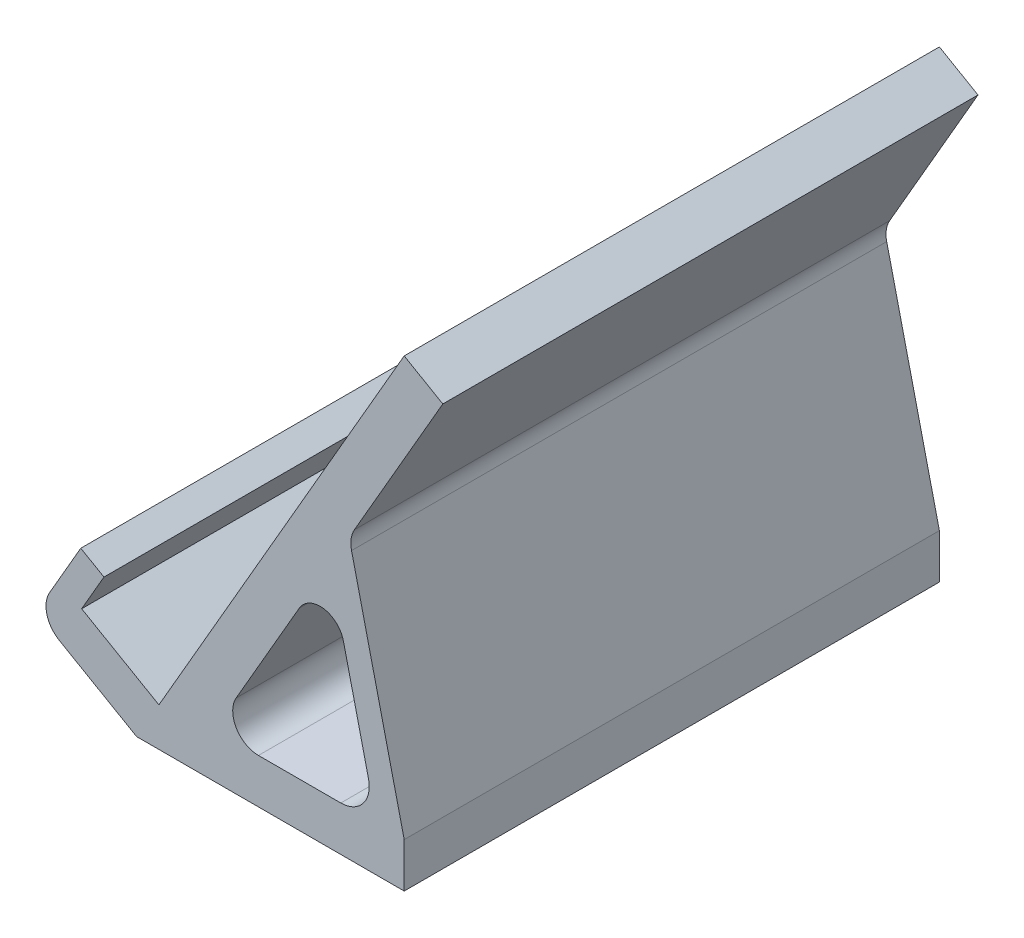
ISO-10303-21;
HEADER;
FILE_DESCRIPTION(('STEP AP214'),'2;1');
FILE_NAME('part.step','',(''),(''),'','','');
FILE_SCHEMA(('AUTOMOTIVE_DESIGN { 1 0 10303 214 1 1 1 1 }'));
ENDSEC;
DATA;
#1=APPLICATION_CONTEXT('core data for automotive mechanical design processes');
#2=APPLICATION_PROTOCOL_DEFINITION('international standard','automotive_design',2000,#1);
#3=PRODUCT_CONTEXT('',#1,'mechanical');
#4=PRODUCT('Part','Part','',(#3));
#5=PRODUCT_RELATED_PRODUCT_CATEGORY('part','',(#4));
#6=PRODUCT_DEFINITION_FORMATION('','',#4);
#7=PRODUCT_DEFINITION_CONTEXT('part definition',#1,'design');
#8=PRODUCT_DEFINITION('design','',#6,#7);
#9=PRODUCT_DEFINITION_SHAPE('','',#8);
#10=(LENGTH_UNIT() NAMED_UNIT(*) SI_UNIT(.MILLI.,.METRE.));
#11=(NAMED_UNIT(*) PLANE_ANGLE_UNIT() SI_UNIT($,.RADIAN.));
#12=(NAMED_UNIT(*) SI_UNIT($,.STERADIAN.) SOLID_ANGLE_UNIT());
#13=UNCERTAINTY_MEASURE_WITH_UNIT(LENGTH_MEASURE(1.E-05),#10,'distance_accuracy_value','');
#14=(GEOMETRIC_REPRESENTATION_CONTEXT(3) GLOBAL_UNCERTAINTY_ASSIGNED_CONTEXT((#13)) GLOBAL_UNIT_ASSIGNED_CONTEXT((#10,
#11,#12)) REPRESENTATION_CONTEXT('',''));
#15=CARTESIAN_POINT('',(0.,0.,0.));
#16=DIRECTION('',(0.,0.,1.));
#17=DIRECTION('',(1.,0.,0.));
#18=AXIS2_PLACEMENT_3D('',#15,#16,#17);
#19=CARTESIAN_POINT('',(22.891964338784,8.18932038964447,0.));
#20=DIRECTION('',(0.,0.,1.));
#21=DIRECTION('',(1.,0.,0.));
#22=AXIS2_PLACEMENT_3D('',#19,#20,#21);
#23=CYLINDRICAL_SURFACE('',#22,3.18932038964447);
#24=DIRECTION('',(0.,0.,-1.));
#25=VECTOR('',#24,1.);
#26=CARTESIAN_POINT('',(25.9966140930536,8.91933028760194,0.));
#27=LINE('',#26,#25);
#28=CARTESIAN_POINT('',(25.9966140930536,8.91933028760194,0.));
#29=VERTEX_POINT('',#28);
#30=CARTESIAN_POINT('',(25.9966140930536,8.91933028760194,60.));
#31=VERTEX_POINT('',#30);
#32=EDGE_CURVE('E329',#29,#31,#27,.F.);
#33=ORIENTED_EDGE('',*,*,#32,.F.);
#34=CARTESIAN_POINT('',(22.891964338784,8.18932038964447,0.));
#35=DIRECTION('',(0.,0.,-1.));
#36=DIRECTION('',(-1.,0.,0.));
#37=AXIS2_PLACEMENT_3D('',#34,#35,#36);
#38=CIRCLE('',#37,3.18932038964447);
#39=CARTESIAN_POINT('',(22.891964338784,5.,0.));
#40=VERTEX_POINT('',#39);
#41=EDGE_CURVE('E337',#29,#40,#38,.T.);
#42=ORIENTED_EDGE('',*,*,#41,.T.);
#43=DIRECTION('',(0.,0.,-1.));
#44=VECTOR('',#43,1.);
#45=CARTESIAN_POINT('',(22.891964338784,5.,0.));
#46=LINE('',#45,#44);
#47=CARTESIAN_POINT('',(22.891964338784,5.,60.));
#48=VERTEX_POINT('',#47);
#49=EDGE_CURVE('E333',#48,#40,#46,.T.);
#50=ORIENTED_EDGE('',*,*,#49,.F.);
#51=CARTESIAN_POINT('',(22.891964338784,8.18932038964447,60.));
#52=DIRECTION('',(0.,0.,-1.));
#53=DIRECTION('',(-1.,0.,0.));
#54=AXIS2_PLACEMENT_3D('',#51,#52,#53);
#55=CIRCLE('',#54,3.18932038964447);
#56=EDGE_CURVE('E340',#48,#31,#55,.F.);
#57=ORIENTED_EDGE('',*,*,#56,.T.);
#58=EDGE_LOOP('',(#33,#42,#50,#57));
#59=FACE_BOUND('',#58,.T.);
#60=ADVANCED_FACE('F47',(#59),#23,.F.);
#61=CARTESIAN_POINT('',(13.6602540378443,7.88675134594811,0.));
#62=DIRECTION('',(0.,0.,1.));
#63=DIRECTION('',(1.,0.,0.));
#64=AXIS2_PLACEMENT_3D('',#61,#62,#63);
#65=CYLINDRICAL_SURFACE('',#64,2.88675134594811);
#66=DIRECTION('',(0.,0.,-1.));
#67=VECTOR('',#66,1.);
#68=CARTESIAN_POINT('',(13.6602540378443,5.,0.));
#69=LINE('',#68,#67);
#70=CARTESIAN_POINT('',(13.6602540378443,5.,0.));
#71=VERTEX_POINT('',#70);
#72=CARTESIAN_POINT('',(13.6602540378443,5.,60.));
#73=VERTEX_POINT('',#72);
#74=EDGE_CURVE('E314',#71,#73,#69,.F.);
#75=ORIENTED_EDGE('',*,*,#74,.F.);
#76=CARTESIAN_POINT('',(13.6602540378443,7.88675134594811,0.));
#77=DIRECTION('',(0.,0.,-1.));
#78=DIRECTION('',(-1.,0.,0.));
#79=AXIS2_PLACEMENT_3D('',#76,#77,#78);
#80=CIRCLE('',#79,2.88675134594811);
#81=CARTESIAN_POINT('',(11.1602540378444,9.33012701892221,0.));
#82=VERTEX_POINT('',#81);
#83=EDGE_CURVE('E322',#71,#82,#80,.T.);
#84=ORIENTED_EDGE('',*,*,#83,.T.);
#85=DIRECTION('',(0.,0.,-1.));
#86=VECTOR('',#85,1.);
#87=CARTESIAN_POINT('',(11.1602540378443,9.33012701892216,0.));
#88=LINE('',#87,#86);
#89=CARTESIAN_POINT('',(11.1602540378444,9.33012701892221,60.));
#90=VERTEX_POINT('',#89);
#91=EDGE_CURVE('E318',#90,#82,#88,.T.);
#92=ORIENTED_EDGE('',*,*,#91,.F.);
#93=CARTESIAN_POINT('',(13.6602540378443,7.88675134594812,60.));
#94=DIRECTION('',(0.,0.,-1.));
#95=DIRECTION('',(-1.,0.,0.));
#96=AXIS2_PLACEMENT_3D('',#93,#94,#95);
#97=CIRCLE('',#96,2.88675134594811);
#98=EDGE_CURVE('E325',#90,#73,#97,.F.);
#99=ORIENTED_EDGE('',*,*,#98,.T.);
#100=EDGE_LOOP('',(#75,#84,#92,#99));
#101=FACE_BOUND('',#100,.T.);
#102=ADVANCED_FACE('F424',(#101),#65,.F.);
#103=CARTESIAN_POINT('',(20.5699420458708,20.2499561852727,0.));
#104=DIRECTION('',(0.,0.,1.));
#105=DIRECTION('',(1.,0.,0.));
#106=AXIS2_PLACEMENT_3D('',#103,#104,#105);
#107=CYLINDRICAL_SURFACE('',#106,2.68911427346148);
#108=DIRECTION('',(0.,0.,-1.));
#109=VECTOR('',#108,1.);
#110=CARTESIAN_POINT('',(18.2411007713738,21.5945133220034,0.));
#111=LINE('',#110,#109);
#112=CARTESIAN_POINT('',(18.2411007713738,21.5945133220034,0.));
#113=VERTEX_POINT('',#112);
#114=CARTESIAN_POINT('',(18.2411007713738,21.5945133220034,60.));
#115=VERTEX_POINT('',#114);
#116=EDGE_CURVE('E298',#113,#115,#111,.F.);
#117=ORIENTED_EDGE('',*,*,#116,.F.);
#118=CARTESIAN_POINT('',(20.5699420458708,20.2499561852727,0.));
#119=DIRECTION('',(0.,0.,-1.));
#120=DIRECTION('',(-1.,0.,0.));
#121=AXIS2_PLACEMENT_3D('',#118,#119,#120);
#122=CIRCLE('',#121,2.68911427346148);
#123=CARTESIAN_POINT('',(23.1876652433937,20.8654729087539,0.));
#124=VERTEX_POINT('',#123);
#125=EDGE_CURVE('E306',#113,#124,#122,.T.);
#126=ORIENTED_EDGE('',*,*,#125,.T.);
#127=DIRECTION('',(0.,0.,-1.));
#128=VECTOR('',#127,1.);
#129=CARTESIAN_POINT('',(23.1876652433937,20.8654729087539,0.));
#130=LINE('',#129,#128);
#131=CARTESIAN_POINT('',(23.1876652433937,20.8654729087539,60.));
#132=VERTEX_POINT('',#131);
#133=EDGE_CURVE('E302',#132,#124,#130,.T.);
#134=ORIENTED_EDGE('',*,*,#133,.F.);
#135=CARTESIAN_POINT('',(20.5699420458708,20.2499561852727,60.));
#136=DIRECTION('',(0.,0.,-1.));
#137=DIRECTION('',(-1.,0.,0.));
#138=AXIS2_PLACEMENT_3D('',#135,#136,#137);
#139=CIRCLE('',#138,2.68911427346148);
#140=EDGE_CURVE('E310',#132,#115,#139,.F.);
#141=ORIENTED_EDGE('',*,*,#140,.T.);
#142=EDGE_LOOP('',(#117,#126,#134,#141));
#143=FACE_BOUND('',#142,.T.);
#144=ADVANCED_FACE('F412',(#143),#107,.F.);
#145=CARTESIAN_POINT('',(4.3301270189222,-2.49999999999999,60.));
#146=DIRECTION('',(-0.86602540378444,0.499999999999998,0.));
#147=DIRECTION('',(-0.499999999999998,-0.86602540378444,0.));
#148=AXIS2_PLACEMENT_3D('',#145,#146,#147);
#149=PLANE('',#148);
#150=DIRECTION('',(0.499999999999998,0.86602540378444,0.));
#151=VECTOR('',#150,1.);
#152=CARTESIAN_POINT('',(4.3301270189222,-2.49999999999999,60.));
#153=LINE('',#152,#151);
#154=EDGE_CURVE('E236',#90,#115,#153,.T.);
#155=ORIENTED_EDGE('',*,*,#154,.F.);
#156=ORIENTED_EDGE('',*,*,#91,.T.);
#157=DIRECTION('',(0.499999999999998,0.86602540378444,0.));
#158=VECTOR('',#157,1.);
#159=CARTESIAN_POINT('',(4.3301270189222,-2.49999999999999,0.));
#160=LINE('',#159,#158);
#161=EDGE_CURVE('E259',#82,#113,#160,.T.);
#162=ORIENTED_EDGE('',*,*,#161,.T.);
#163=ORIENTED_EDGE('',*,*,#116,.T.);
#164=EDGE_LOOP('',(#155,#156,#162,#163));
#165=FACE_BOUND('',#164,.T.);
#166=ADVANCED_FACE('F419',(#165),#149,.F.);
#167=CARTESIAN_POINT('',(24.4186170644176,32.2942854061398,60.));
#168=VERTEX_POINT('',#167);
#169=CARTESIAN_POINT('',(34.3301270189221,49.4615242270664,60.));
#170=VERTEX_POINT('',#169);
#171=EDGE_CURVE('E240',#168,#170,#153,.T.);
#172=ORIENTED_EDGE('',*,*,#171,.F.);
#173=DIRECTION('',(0.,0.,1.));
#174=VECTOR('',#173,1.);
#175=CARTESIAN_POINT('',(24.4186170644176,32.2942854061398,60.));
#176=LINE('',#175,#174);
#177=CARTESIAN_POINT('',(24.4186170644176,32.2942854061398,0.));
#178=VERTEX_POINT('',#177);
#179=EDGE_CURVE('E347',#168,#178,#176,.F.);
#180=ORIENTED_EDGE('',*,*,#179,.T.);
#181=CARTESIAN_POINT('',(34.3301270189221,49.4615242270664,0.));
#182=VERTEX_POINT('',#181);
#183=EDGE_CURVE('E228',#178,#182,#160,.T.);
#184=ORIENTED_EDGE('',*,*,#183,.T.);
#185=DIRECTION('',(0.,0.,-1.));
#186=VECTOR('',#185,1.);
#187=CARTESIAN_POINT('',(34.3301270189221,49.4615242270664,60.));
#188=LINE('',#187,#186);
#189=EDGE_CURVE('E294',#170,#182,#188,.T.);
#190=ORIENTED_EDGE('',*,*,#189,.F.);
#191=EDGE_LOOP('',(#172,#180,#184,#190));
#192=FACE_BOUND('',#191,.T.);
#193=ADVANCED_FACE('F371',(#192),#149,.F.);
#194=CARTESIAN_POINT('',(0.,5.,60.));
#195=DIRECTION('',(0.,-1.,0.));
#196=DIRECTION('',(0.,0.,-1.));
#197=AXIS2_PLACEMENT_3D('',#194,#195,#196);
#198=PLANE('',#197);
#199=DIRECTION('',(1.,0.,0.));
#200=VECTOR('',#199,1.);
#201=CARTESIAN_POINT('',(0.,5.,60.));
#202=LINE('',#201,#200);
#203=EDGE_CURVE('E255',#48,#73,#202,.F.);
#204=ORIENTED_EDGE('',*,*,#203,.F.);
#205=ORIENTED_EDGE('',*,*,#49,.T.);
#206=DIRECTION('',(1.,0.,0.));
#207=VECTOR('',#206,1.);
#208=CARTESIAN_POINT('',(0.,5.,0.));
#209=LINE('',#208,#207);
#210=EDGE_CURVE('E277',#40,#71,#209,.F.);
#211=ORIENTED_EDGE('',*,*,#210,.T.);
#212=ORIENTED_EDGE('',*,*,#74,.T.);
#213=EDGE_LOOP('',(#204,#205,#211,#212));
#214=FACE_BOUND('',#213,.T.);
#215=ADVANCED_FACE('F427',(#214),#198,.F.);
#216=CARTESIAN_POINT('',(29.9999999999999,51.9615242270664,60.));
#217=DIRECTION('',(0.499999999999995,0.866025403784441,0.));
#218=DIRECTION('',(-0.866025403784441,0.499999999999995,0.));
#219=AXIS2_PLACEMENT_3D('',#216,#217,#218);
#220=PLANE('',#219);
#221=DIRECTION('',(0.866025403784441,-0.499999999999995,0.));
#222=VECTOR('',#221,1.);
#223=CARTESIAN_POINT('',(29.9999999999999,51.9615242270664,0.));
#224=LINE('',#223,#222);
#225=CARTESIAN_POINT('',(29.9999999999999,51.9615242270664,0.));
#226=VERTEX_POINT('',#225);
#227=EDGE_CURVE('E262',#226,#182,#224,.T.);
#228=ORIENTED_EDGE('',*,*,#227,.F.);
#229=DIRECTION('',(0.,0.,-1.));
#230=VECTOR('',#229,1.);
#231=CARTESIAN_POINT('',(29.9999999999999,51.9615242270664,60.));
#232=LINE('',#231,#230);
#233=CARTESIAN_POINT('',(29.9999999999999,51.9615242270664,60.));
#234=VERTEX_POINT('',#233);
#235=EDGE_CURVE('E290',#234,#226,#232,.T.);
#236=ORIENTED_EDGE('',*,*,#235,.F.);
#237=DIRECTION('',(0.866025403784441,-0.499999999999995,0.));
#238=VECTOR('',#237,1.);
#239=CARTESIAN_POINT('',(29.9999999999999,51.9615242270664,60.));
#240=LINE('',#239,#238);
#241=EDGE_CURVE('E239',#234,#170,#240,.T.);
#242=ORIENTED_EDGE('',*,*,#241,.T.);
#243=ORIENTED_EDGE('',*,*,#189,.T.);
#244=EDGE_LOOP('',(#228,#236,#242,#243));
#245=FACE_BOUND('',#244,.T.);
#246=ADVANCED_FACE('F474',(#245),#220,.T.);
#247=CARTESIAN_POINT('',(0.,0.,60.));
#248=DIRECTION('',(-0.86602540378444,0.499999999999998,0.));
#249=DIRECTION('',(-0.499999999999998,-0.86602540378444,0.));
#250=AXIS2_PLACEMENT_3D('',#247,#248,#249);
#251=PLANE('',#250);
#252=DIRECTION('',(0.,0.,1.));
#253=VECTOR('',#252,1.);
#254=CARTESIAN_POINT('',(2.5,4.33012701892219,-14.546564555882));
#255=LINE('',#254,#253);
#256=CARTESIAN_POINT('',(2.49999999999999,4.3301270189222,0.));
#257=VERTEX_POINT('',#256);
#258=CARTESIAN_POINT('',(2.5,4.33012701892219,60.));
#259=VERTEX_POINT('',#258);
#260=EDGE_CURVE('E222',#257,#259,#255,.T.);
#261=ORIENTED_EDGE('',*,*,#260,.T.);
#262=DIRECTION('',(0.499999999999998,0.86602540378444,0.));
#263=VECTOR('',#262,1.);
#264=CARTESIAN_POINT('',(0.,0.,60.));
#265=LINE('',#264,#263);
#266=EDGE_CURVE('E244',#259,#234,#265,.T.);
#267=ORIENTED_EDGE('',*,*,#266,.T.);
#268=ORIENTED_EDGE('',*,*,#235,.T.);
#269=DIRECTION('',(0.499999999999998,0.86602540378444,0.));
#270=VECTOR('',#269,1.);
#271=CARTESIAN_POINT('',(0.,0.,0.));
#272=LINE('',#271,#270);
#273=EDGE_CURVE('E266',#257,#226,#272,.T.);
#274=ORIENTED_EDGE('',*,*,#273,.F.);
#275=EDGE_LOOP('',(#261,#267,#268,#274));
#276=FACE_BOUND('',#275,.T.);
#277=ADVANCED_FACE('F481',(#276),#251,.T.);
#278=CARTESIAN_POINT('',(0.,0.,60.));
#279=DIRECTION('',(0.,-1.,0.));
#280=DIRECTION('',(0.,0.,-1.));
#281=AXIS2_PLACEMENT_3D('',#278,#279,#280);
#282=PLANE('',#281);
#283=DIRECTION('',(-1.,0.,0.));
#284=VECTOR('',#283,1.);
#285=CARTESIAN_POINT('',(0.,0.,0.));
#286=LINE('',#285,#284);
#287=CARTESIAN_POINT('',(30.,0.,0.));
#288=VERTEX_POINT('',#287);
#289=CARTESIAN_POINT('',(0.,0.,0.));
#290=VERTEX_POINT('',#289);
#291=EDGE_CURVE('E269',#288,#290,#286,.T.);
#292=ORIENTED_EDGE('',*,*,#291,.F.);
#293=DIRECTION('',(0.,0.,-1.));
#294=VECTOR('',#293,1.);
#295=CARTESIAN_POINT('',(30.,0.,60.));
#296=LINE('',#295,#294);
#297=CARTESIAN_POINT('',(30.,0.,60.));
#298=VERTEX_POINT('',#297);
#299=EDGE_CURVE('E283',#298,#288,#296,.T.);
#300=ORIENTED_EDGE('',*,*,#299,.F.);
#301=DIRECTION('',(-1.,0.,0.));
#302=VECTOR('',#301,1.);
#303=CARTESIAN_POINT('',(0.,0.,60.));
#304=LINE('',#303,#302);
#305=CARTESIAN_POINT('',(0.,0.,60.));
#306=VERTEX_POINT('',#305);
#307=EDGE_CURVE('E247',#298,#306,#304,.T.);
#308=ORIENTED_EDGE('',*,*,#307,.T.);
#309=DIRECTION('',(0.,0.,-1.));
#310=VECTOR('',#309,1.);
#311=CARTESIAN_POINT('',(0.,0.,60.));
#312=LINE('',#311,#310);
#313=EDGE_CURVE('E286',#306,#290,#312,.T.);
#314=ORIENTED_EDGE('',*,*,#313,.T.);
#315=EDGE_LOOP('',(#292,#300,#308,#314));
#316=FACE_BOUND('',#315,.T.);
#317=ADVANCED_FACE('F477',(#316),#282,.T.);
#318=CARTESIAN_POINT('',(30.,5.,60.));
#319=DIRECTION('',(1.,0.,0.));
#320=DIRECTION('',(0.,0.,-1.));
#321=AXIS2_PLACEMENT_3D('',#318,#319,#320);
#322=PLANE('',#321);
#323=DIRECTION('',(0.,-1.,0.));
#324=VECTOR('',#323,1.);
#325=CARTESIAN_POINT('',(30.,5.,0.));
#326=LINE('',#325,#324);
#327=CARTESIAN_POINT('',(30.,5.,0.));
#328=VERTEX_POINT('',#327);
#329=EDGE_CURVE('E273',#328,#288,#326,.T.);
#330=ORIENTED_EDGE('',*,*,#329,.F.);
#331=DIRECTION('',(0.,0.,-1.));
#332=VECTOR('',#331,1.);
#333=CARTESIAN_POINT('',(30.,5.,60.));
#334=LINE('',#333,#332);
#335=CARTESIAN_POINT('',(30.,5.,60.));
#336=VERTEX_POINT('',#335);
#337=EDGE_CURVE('E258',#336,#328,#334,.T.);
#338=ORIENTED_EDGE('',*,*,#337,.F.);
#339=DIRECTION('',(0.,-1.,0.));
#340=VECTOR('',#339,1.);
#341=CARTESIAN_POINT('',(30.,5.,60.));
#342=LINE('',#341,#340);
#343=EDGE_CURVE('E251',#336,#298,#342,.T.);
#344=ORIENTED_EDGE('',*,*,#343,.T.);
#345=ORIENTED_EDGE('',*,*,#299,.T.);
#346=EDGE_LOOP('',(#330,#338,#344,#345));
#347=FACE_BOUND('',#346,.T.);
#348=ADVANCED_FACE('F470',(#347),#322,.T.);
#349=CARTESIAN_POINT('',(0.,0.,60.));
#350=DIRECTION('',(0.,0.,-1.));
#351=DIRECTION('',(-1.,0.,0.));
#352=AXIS2_PLACEMENT_3D('',#349,#350,#351);
#353=PLANE('',#352);
#354=ORIENTED_EDGE('',*,*,#56,.F.);
#355=ORIENTED_EDGE('',*,*,#203,.T.);
#356=ORIENTED_EDGE('',*,*,#98,.F.);
#357=ORIENTED_EDGE('',*,*,#154,.T.);
#358=ORIENTED_EDGE('',*,*,#140,.F.);
#359=DIRECTION('',(-0.228891992265115,0.973451825144371,0.));
#360=VECTOR('',#359,1.);
#361=CARTESIAN_POINT('',(27.0796445245669,4.31332402320466,60.));
#362=LINE('',#361,#360);
#363=EDGE_CURVE('E382',#31,#132,#362,.T.);
#364=ORIENTED_EDGE('',*,*,#363,.F.);
#365=EDGE_LOOP('',(#354,#355,#356,#357,#358,#364));
#366=FACE_BOUND('',#365,.T.);
#367=DIRECTION('',(0.5,0.866025403784439,0.));
#368=VECTOR('',#367,1.);
#369=CARTESIAN_POINT('',(-11.2583302491977,6.5,60.));
#370=LINE('',#369,#368);
#371=CARTESIAN_POINT('',(-9.7583302491977,9.09807621135331,60.));
#372=VERTEX_POINT('',#371);
#373=CARTESIAN_POINT('',(-6.2583302491977,15.1602540378444,60.));
#374=VERTEX_POINT('',#373);
#375=EDGE_CURVE('E195',#372,#374,#370,.T.);
#376=ORIENTED_EDGE('',*,*,#375,.F.);
#377=CARTESIAN_POINT('',(-7.16025403784439,7.59807621135331,60.));
#378=DIRECTION('',(0.,0.,-1.));
#379=DIRECTION('',(-1.,0.,0.));
#380=AXIS2_PLACEMENT_3D('',#377,#378,#379);
#381=CIRCLE('',#380,3.);
#382=CARTESIAN_POINT('',(-8.66025403784439,5.,60.));
#383=VERTEX_POINT('',#382);
#384=EDGE_CURVE('E71',#372,#383,#381,.F.);
#385=ORIENTED_EDGE('',*,*,#384,.T.);
#386=DIRECTION('',(-0.866025403784439,0.5,0.));
#387=VECTOR('',#386,1.);
#388=CARTESIAN_POINT('',(0.,0.,60.));
#389=LINE('',#388,#387);
#390=EDGE_CURVE('E218',#306,#383,#389,.T.);
#391=ORIENTED_EDGE('',*,*,#390,.F.);
#392=ORIENTED_EDGE('',*,*,#307,.F.);
#393=ORIENTED_EDGE('',*,*,#343,.F.);
#394=DIRECTION('',(-0.228891992265115,0.973451825144371,0.));
#395=VECTOR('',#394,1.);
#396=CARTESIAN_POINT('',(30.,5.,60.));
#397=LINE('',#396,#395);
#398=CARTESIAN_POINT('',(24.0963378003378,30.1076094293445,60.));
#399=VERTEX_POINT('',#398);
#400=EDGE_CURVE('E366',#336,#399,#397,.T.);
#401=ORIENTED_EDGE('',*,*,#400,.T.);
#402=CARTESIAN_POINT('',(27.0166932757709,30.7942854061398,60.));
#403=DIRECTION('',(0.,0.,-1.));
#404=DIRECTION('',(-1.,0.,0.));
#405=AXIS2_PLACEMENT_3D('',#402,#403,#404);
#406=CIRCLE('',#405,3.);
#407=EDGE_CURVE('E56',#399,#168,#406,.T.);
#408=ORIENTED_EDGE('',*,*,#407,.T.);
#409=ORIENTED_EDGE('',*,*,#171,.T.);
#410=ORIENTED_EDGE('',*,*,#241,.F.);
#411=ORIENTED_EDGE('',*,*,#266,.F.);
#412=DIRECTION('',(-0.866025403784439,0.5,0.));
#413=VECTOR('',#412,1.);
#414=CARTESIAN_POINT('',(2.5,4.33012701892219,60.));
#415=LINE('',#414,#413);
#416=CARTESIAN_POINT('',(-6.16025403784439,9.33012701892219,60.));
#417=VERTEX_POINT('',#416);
#418=EDGE_CURVE('E221',#259,#417,#415,.T.);
#419=ORIENTED_EDGE('',*,*,#418,.T.);
#420=DIRECTION('',(0.5,0.866025403784439,0.));
#421=VECTOR('',#420,1.);
#422=CARTESIAN_POINT('',(-8.66025403784439,5.,60.));
#423=LINE('',#422,#421);
#424=CARTESIAN_POINT('',(-3.66025403784439,13.6602540378444,60.));
#425=VERTEX_POINT('',#424);
#426=EDGE_CURVE('E190',#417,#425,#423,.T.);
#427=ORIENTED_EDGE('',*,*,#426,.T.);
#428=DIRECTION('',(0.866025403784438,-0.500000000000001,0.));
#429=VECTOR('',#428,1.);
#430=CARTESIAN_POINT('',(-6.2583302491977,15.1602540378444,60.));
#431=LINE('',#430,#429);
#432=EDGE_CURVE('E200',#374,#425,#431,.T.);
#433=ORIENTED_EDGE('',*,*,#432,.F.);
#434=EDGE_LOOP('',(#376,#385,#391,#392,#393,#401,#408,#409,#410,#411,#419,#427,#433));
#435=FACE_BOUND('',#434,.T.);
#436=ADVANCED_FACE('F361',(#366,#435),#353,.F.);
#437=CARTESIAN_POINT('',(0.,0.,0.));
#438=DIRECTION('',(0.,0.,-1.));
#439=DIRECTION('',(-1.,0.,0.));
#440=AXIS2_PLACEMENT_3D('',#437,#438,#439);
#441=PLANE('',#440);
#442=ORIENTED_EDGE('',*,*,#41,.F.);
#443=DIRECTION('',(-0.228891992265115,0.973451825144371,0.));
#444=VECTOR('',#443,1.);
#445=CARTESIAN_POINT('',(27.0796445245669,4.31332402320466,0.));
#446=LINE('',#445,#444);
#447=EDGE_CURVE('E388',#29,#124,#446,.T.);
#448=ORIENTED_EDGE('',*,*,#447,.T.);
#449=ORIENTED_EDGE('',*,*,#125,.F.);
#450=ORIENTED_EDGE('',*,*,#161,.F.);
#451=ORIENTED_EDGE('',*,*,#83,.F.);
#452=ORIENTED_EDGE('',*,*,#210,.F.);
#453=EDGE_LOOP('',(#442,#448,#449,#450,#451,#452));
#454=FACE_BOUND('',#453,.T.);
#455=DIRECTION('',(-0.866025403784439,0.5,0.));
#456=VECTOR('',#455,1.);
#457=CARTESIAN_POINT('',(0.,0.,0.));
#458=LINE('',#457,#456);
#459=CARTESIAN_POINT('',(-8.66025403784439,5.,0.));
#460=VERTEX_POINT('',#459);
#461=EDGE_CURVE('E226',#290,#460,#458,.T.);
#462=ORIENTED_EDGE('',*,*,#461,.T.);
#463=CARTESIAN_POINT('',(-7.16025403784439,7.59807621135331,0.));
#464=DIRECTION('',(0.,0.,-1.));
#465=DIRECTION('',(-1.,0.,0.));
#466=AXIS2_PLACEMENT_3D('',#463,#464,#465);
#467=CIRCLE('',#466,3.);
#468=CARTESIAN_POINT('',(-9.7583302491977,9.09807621135331,0.));
#469=VERTEX_POINT('',#468);
#470=EDGE_CURVE('E185',#460,#469,#467,.T.);
#471=ORIENTED_EDGE('',*,*,#470,.T.);
#472=DIRECTION('',(0.5,0.866025403784439,0.));
#473=VECTOR('',#472,1.);
#474=CARTESIAN_POINT('',(-11.2583302491977,6.5,0.));
#475=LINE('',#474,#473);
#476=CARTESIAN_POINT('',(-6.2583302491977,15.1602540378444,0.));
#477=VERTEX_POINT('',#476);
#478=EDGE_CURVE('E179',#469,#477,#475,.T.);
#479=ORIENTED_EDGE('',*,*,#478,.T.);
#480=DIRECTION('',(0.866025403784438,-0.500000000000001,0.));
#481=VECTOR('',#480,1.);
#482=CARTESIAN_POINT('',(-6.2583302491977,15.1602540378444,0.));
#483=LINE('',#482,#481);
#484=CARTESIAN_POINT('',(-3.66025403784439,13.6602540378444,0.));
#485=VERTEX_POINT('',#484);
#486=EDGE_CURVE('E183',#477,#485,#483,.T.);
#487=ORIENTED_EDGE('',*,*,#486,.T.);
#488=DIRECTION('',(0.5,0.866025403784439,0.));
#489=VECTOR('',#488,1.);
#490=CARTESIAN_POINT('',(-8.66025403784439,5.,0.));
#491=LINE('',#490,#489);
#492=CARTESIAN_POINT('',(-6.16025403784439,9.33012701892219,0.));
#493=VERTEX_POINT('',#492);
#494=EDGE_CURVE('E214',#493,#485,#491,.T.);
#495=ORIENTED_EDGE('',*,*,#494,.F.);
#496=DIRECTION('',(-0.866025403784439,0.5,0.));
#497=VECTOR('',#496,1.);
#498=CARTESIAN_POINT('',(2.5,4.33012701892219,0.));
#499=LINE('',#498,#497);
#500=EDGE_CURVE('E207',#257,#493,#499,.T.);
#501=ORIENTED_EDGE('',*,*,#500,.F.);
#502=ORIENTED_EDGE('',*,*,#273,.T.);
#503=ORIENTED_EDGE('',*,*,#227,.T.);
#504=ORIENTED_EDGE('',*,*,#183,.F.);
#505=CARTESIAN_POINT('',(27.0166932757709,30.7942854061398,0.));
#506=DIRECTION('',(0.,0.,-1.));
#507=DIRECTION('',(-1.,0.,0.));
#508=AXIS2_PLACEMENT_3D('',#505,#506,#507);
#509=CIRCLE('',#508,3.);
#510=CARTESIAN_POINT('',(24.0963378003378,30.1076094293445,0.));
#511=VERTEX_POINT('',#510);
#512=EDGE_CURVE('E11',#178,#511,#509,.F.);
#513=ORIENTED_EDGE('',*,*,#512,.T.);
#514=DIRECTION('',(-0.228891992265115,0.973451825144371,0.));
#515=VECTOR('',#514,1.);
#516=CARTESIAN_POINT('',(30.,5.,0.));
#517=LINE('',#516,#515);
#518=EDGE_CURVE('E378',#328,#511,#517,.T.);
#519=ORIENTED_EDGE('',*,*,#518,.F.);
#520=ORIENTED_EDGE('',*,*,#329,.T.);
#521=ORIENTED_EDGE('',*,*,#291,.T.);
#522=EDGE_LOOP('',(#462,#471,#479,#487,#495,#501,#502,#503,#504,#513,#519,#520,#521));
#523=FACE_BOUND('',#522,.T.);
#524=ADVANCED_FACE('F181',(#454,#523),#441,.T.);
#525=CARTESIAN_POINT('',(2.5,4.33012701892219,-14.546564555882));
#526=DIRECTION('',(0.5,0.866025403784439,0.));
#527=DIRECTION('',(-0.866025403784439,0.5,0.));
#528=AXIS2_PLACEMENT_3D('',#525,#526,#527);
#529=PLANE('',#528);
#530=ORIENTED_EDGE('',*,*,#260,.F.);
#531=ORIENTED_EDGE('',*,*,#500,.T.);
#532=DIRECTION('',(0.,0.,1.));
#533=VECTOR('',#532,1.);
#534=CARTESIAN_POINT('',(-6.16025403784439,9.33012701892219,-14.546564555882));
#535=LINE('',#534,#533);
#536=EDGE_CURVE('E211',#493,#417,#535,.T.);
#537=ORIENTED_EDGE('',*,*,#536,.T.);
#538=ORIENTED_EDGE('',*,*,#418,.F.);
#539=EDGE_LOOP('',(#530,#531,#537,#538));
#540=FACE_BOUND('',#539,.T.);
#541=ADVANCED_FACE('F464',(#540),#529,.T.);
#542=CARTESIAN_POINT('',(0.,0.,-14.546564555882));
#543=DIRECTION('',(0.5,0.866025403784439,0.));
#544=DIRECTION('',(-0.866025403784439,0.5,0.));
#545=AXIS2_PLACEMENT_3D('',#542,#543,#544);
#546=PLANE('',#545);
#547=ORIENTED_EDGE('',*,*,#390,.T.);
#548=DIRECTION('',(0.,0.,1.));
#549=VECTOR('',#548,1.);
#550=CARTESIAN_POINT('',(-8.66025403784439,5.,-14.546564555882));
#551=LINE('',#550,#549);
#552=EDGE_CURVE('E63',#383,#460,#551,.F.);
#553=ORIENTED_EDGE('',*,*,#552,.T.);
#554=ORIENTED_EDGE('',*,*,#461,.F.);
#555=ORIENTED_EDGE('',*,*,#313,.F.);
#556=EDGE_LOOP('',(#547,#553,#554,#555));
#557=FACE_BOUND('',#556,.T.);
#558=ADVANCED_FACE('F461',(#557),#546,.F.);
#559=CARTESIAN_POINT('',(-8.66025403784439,5.,-12.687061292004));
#560=DIRECTION('',(0.866025403784438,-0.5,0.));
#561=DIRECTION('',(0.5,0.866025403784439,0.));
#562=AXIS2_PLACEMENT_3D('',#559,#560,#561);
#563=PLANE('',#562);
#564=ORIENTED_EDGE('',*,*,#426,.F.);
#565=ORIENTED_EDGE('',*,*,#536,.F.);
#566=ORIENTED_EDGE('',*,*,#494,.T.);
#567=DIRECTION('',(0.,0.,1.));
#568=VECTOR('',#567,1.);
#569=CARTESIAN_POINT('',(-3.66025403784439,13.6602540378444,-12.687061292004));
#570=LINE('',#569,#568);
#571=EDGE_CURVE('E205',#485,#425,#570,.T.);
#572=ORIENTED_EDGE('',*,*,#571,.T.);
#573=EDGE_LOOP('',(#564,#565,#566,#572));
#574=FACE_BOUND('',#573,.T.);
#575=ADVANCED_FACE('F398',(#574),#563,.T.);
#576=CARTESIAN_POINT('',(-11.2583302491977,6.5,-12.687061292004));
#577=DIRECTION('',(0.866025403784438,-0.5,0.));
#578=DIRECTION('',(0.5,0.866025403784439,0.));
#579=AXIS2_PLACEMENT_3D('',#576,#577,#578);
#580=PLANE('',#579);
#581=ORIENTED_EDGE('',*,*,#478,.F.);
#582=DIRECTION('',(0.,0.,1.));
#583=VECTOR('',#582,1.);
#584=CARTESIAN_POINT('',(-9.7583302491977,9.09807621135331,-12.687061292004));
#585=LINE('',#584,#583);
#586=EDGE_CURVE('E350',#469,#372,#585,.T.);
#587=ORIENTED_EDGE('',*,*,#586,.T.);
#588=ORIENTED_EDGE('',*,*,#375,.T.);
#589=DIRECTION('',(0.,0.,1.));
#590=VECTOR('',#589,1.);
#591=CARTESIAN_POINT('',(-6.2583302491977,15.1602540378444,-12.687061292004));
#592=LINE('',#591,#590);
#593=EDGE_CURVE('E193',#477,#374,#592,.T.);
#594=ORIENTED_EDGE('',*,*,#593,.F.);
#595=EDGE_LOOP('',(#581,#587,#588,#594));
#596=FACE_BOUND('',#595,.T.);
#597=ADVANCED_FACE('F194',(#596),#580,.F.);
#598=CARTESIAN_POINT('',(-6.2583302491977,15.1602540378444,-12.687061292004));
#599=DIRECTION('',(-0.500000000000001,-0.866025403784438,0.));
#600=DIRECTION('',(0.866025403784438,-0.500000000000001,0.));
#601=AXIS2_PLACEMENT_3D('',#598,#599,#600);
#602=PLANE('',#601);
#603=ORIENTED_EDGE('',*,*,#486,.F.);
#604=ORIENTED_EDGE('',*,*,#593,.T.);
#605=ORIENTED_EDGE('',*,*,#432,.T.);
#606=ORIENTED_EDGE('',*,*,#571,.F.);
#607=EDGE_LOOP('',(#603,#604,#605,#606));
#608=FACE_BOUND('',#607,.T.);
#609=ADVANCED_FACE('F203',(#608),#602,.F.);
#610=CARTESIAN_POINT('',(27.0796445245669,4.31332402320466,-28.4450569630808));
#611=DIRECTION('',(0.973451825144371,0.228891992265115,0.));
#612=DIRECTION('',(-0.228891992265115,0.973451825144371,0.));
#613=AXIS2_PLACEMENT_3D('',#610,#611,#612);
#614=PLANE('',#613);
#615=ORIENTED_EDGE('',*,*,#447,.F.);
#616=ORIENTED_EDGE('',*,*,#32,.T.);
#617=ORIENTED_EDGE('',*,*,#363,.T.);
#618=ORIENTED_EDGE('',*,*,#133,.T.);
#619=EDGE_LOOP('',(#615,#616,#617,#618));
#620=FACE_BOUND('',#619,.T.);
#621=ADVANCED_FACE('F413',(#620),#614,.F.);
#622=CARTESIAN_POINT('',(30.,5.,-28.4450569630808));
#623=DIRECTION('',(0.973451825144371,0.228891992265115,0.));
#624=DIRECTION('',(-0.228891992265115,0.973451825144371,0.));
#625=AXIS2_PLACEMENT_3D('',#622,#623,#624);
#626=PLANE('',#625);
#627=ORIENTED_EDGE('',*,*,#518,.T.);
#628=DIRECTION('',(0.,0.,1.));
#629=VECTOR('',#628,1.);
#630=CARTESIAN_POINT('',(24.0963378003378,30.1076094293445,-28.4450569630808));
#631=LINE('',#630,#629);
#632=EDGE_CURVE('E343',#511,#399,#631,.T.);
#633=ORIENTED_EDGE('',*,*,#632,.T.);
#634=ORIENTED_EDGE('',*,*,#400,.F.);
#635=ORIENTED_EDGE('',*,*,#337,.T.);
#636=EDGE_LOOP('',(#627,#633,#634,#635));
#637=FACE_BOUND('',#636,.T.);
#638=ADVANCED_FACE('F380',(#637),#626,.T.);
#639=CARTESIAN_POINT('',(27.0166932757709,30.7942854061398,-28.4450569630808));
#640=DIRECTION('',(0.,0.,1.));
#641=DIRECTION('',(1.,0.,0.));
#642=AXIS2_PLACEMENT_3D('',#639,#640,#641);
#643=CYLINDRICAL_SURFACE('',#642,3.);
#644=ORIENTED_EDGE('',*,*,#512,.F.);
#645=ORIENTED_EDGE('',*,*,#179,.F.);
#646=ORIENTED_EDGE('',*,*,#407,.F.);
#647=ORIENTED_EDGE('',*,*,#632,.F.);
#648=EDGE_LOOP('',(#644,#645,#646,#647));
#649=FACE_BOUND('',#648,.T.);
#650=ADVANCED_FACE('F375',(#649),#643,.F.);
#651=CARTESIAN_POINT('',(-7.16025403784439,7.59807621135331,-12.687061292004));
#652=DIRECTION('',(0.,0.,1.));
#653=DIRECTION('',(1.,0.,0.));
#654=AXIS2_PLACEMENT_3D('',#651,#652,#653);
#655=CYLINDRICAL_SURFACE('',#654,3.);
#656=ORIENTED_EDGE('',*,*,#470,.F.);
#657=ORIENTED_EDGE('',*,*,#552,.F.);
#658=ORIENTED_EDGE('',*,*,#384,.F.);
#659=ORIENTED_EDGE('',*,*,#586,.F.);
#660=EDGE_LOOP('',(#656,#657,#658,#659));
#661=FACE_BOUND('',#660,.T.);
#662=ADVANCED_FACE('F49',(#661),#655,.T.);
#663=CLOSED_SHELL('',(#60,#102,#144,#166,#193,#215,#246,#277,#317,#348,#436,#524,#541,#558,#575,
#597,#609,#621,#638,#650,#662));
#664=MANIFOLD_SOLID_BREP('B2',#663);
#665=ADVANCED_BREP_SHAPE_REPRESENTATION('',(#18,#664),#14);
#666=SHAPE_DEFINITION_REPRESENTATION(#9,#665);
ENDSEC;
END-ISO-10303-21;
